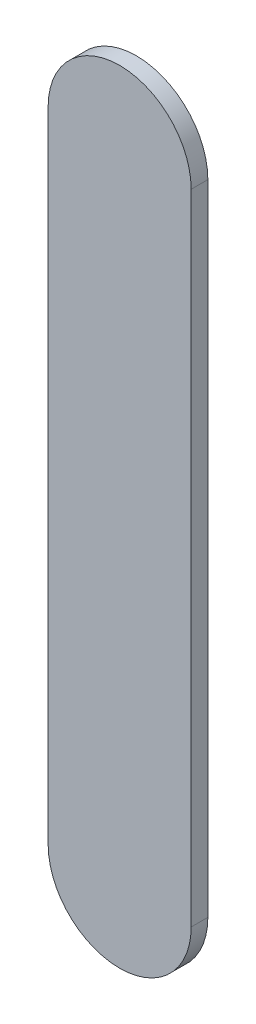
ISO-10303-21;
HEADER;
FILE_DESCRIPTION(('STEP AP214'),'2;1');
FILE_NAME('part.step','',(''),(''),'','','');
FILE_SCHEMA(('AUTOMOTIVE_DESIGN { 1 0 10303 214 1 1 1 1 }'));
ENDSEC;
DATA;
#1=APPLICATION_CONTEXT('core data for automotive mechanical design processes');
#2=APPLICATION_PROTOCOL_DEFINITION('international standard','automotive_design',2000,#1);
#3=PRODUCT_CONTEXT('',#1,'mechanical');
#4=PRODUCT('Part','Part','',(#3));
#5=PRODUCT_RELATED_PRODUCT_CATEGORY('part','',(#4));
#6=PRODUCT_DEFINITION_FORMATION('','',#4);
#7=PRODUCT_DEFINITION_CONTEXT('part definition',#1,'design');
#8=PRODUCT_DEFINITION('design','',#6,#7);
#9=PRODUCT_DEFINITION_SHAPE('','',#8);
#10=(LENGTH_UNIT() NAMED_UNIT(*) SI_UNIT(.MILLI.,.METRE.));
#11=(NAMED_UNIT(*) PLANE_ANGLE_UNIT() SI_UNIT($,.RADIAN.));
#12=(NAMED_UNIT(*) SI_UNIT($,.STERADIAN.) SOLID_ANGLE_UNIT());
#13=UNCERTAINTY_MEASURE_WITH_UNIT(LENGTH_MEASURE(1.E-05),#10,'distance_accuracy_value','');
#14=(GEOMETRIC_REPRESENTATION_CONTEXT(3) GLOBAL_UNCERTAINTY_ASSIGNED_CONTEXT((#13)) GLOBAL_UNIT_ASSIGNED_CONTEXT((#10,
#11,#12)) REPRESENTATION_CONTEXT('',''));
#15=CARTESIAN_POINT('',(0.,0.,0.));
#16=DIRECTION('',(0.,0.,1.));
#17=DIRECTION('',(1.,0.,0.));
#18=AXIS2_PLACEMENT_3D('',#15,#16,#17);
#19=CARTESIAN_POINT('',(127.85,-68.96,0.));
#20=DIRECTION('',(0.,0.,1.));
#21=DIRECTION('',(1.,0.,0.));
#22=AXIS2_PLACEMENT_3D('',#19,#20,#21);
#23=PLANE('',#22);
#24=DIRECTION('',(0.,-1.,0.));
#25=VECTOR('',#24,1.);
#26=CARTESIAN_POINT('',(127.85,-68.96,0.));
#27=LINE('',#26,#25);
#28=CARTESIAN_POINT('',(127.85,-68.96,0.));
#29=VERTEX_POINT('',#28);
#30=CARTESIAN_POINT('',(127.85,-70.3,0.));
#31=VERTEX_POINT('',#30);
#32=EDGE_CURVE('E86',#29,#31,#27,.T.);
#33=ORIENTED_EDGE('',*,*,#32,.T.);
#34=CARTESIAN_POINT('',(128.,-70.3,0.));
#35=DIRECTION('',(0.,0.,1.));
#36=DIRECTION('',(-1.,0.,0.));
#37=AXIS2_PLACEMENT_3D('',#34,#35,#36);
#38=CIRCLE('',#37,0.15);
#39=CARTESIAN_POINT('',(128.15,-70.3,0.));
#40=VERTEX_POINT('',#39);
#41=EDGE_CURVE('E110',#31,#40,#38,.T.);
#42=ORIENTED_EDGE('',*,*,#41,.T.);
#43=DIRECTION('',(0.,1.,0.));
#44=VECTOR('',#43,1.);
#45=CARTESIAN_POINT('',(128.15,-70.3,0.));
#46=LINE('',#45,#44);
#47=CARTESIAN_POINT('',(128.15,-68.96,0.));
#48=VERTEX_POINT('',#47);
#49=EDGE_CURVE('E20',#40,#48,#46,.T.);
#50=ORIENTED_EDGE('',*,*,#49,.T.);
#51=CARTESIAN_POINT('',(128.,-68.96,0.));
#52=DIRECTION('',(0.,0.,1.));
#53=DIRECTION('',(1.,0.,0.));
#54=AXIS2_PLACEMENT_3D('',#51,#52,#53);
#55=CIRCLE('',#54,0.15);
#56=EDGE_CURVE('E11',#48,#29,#55,.T.);
#57=ORIENTED_EDGE('',*,*,#56,.T.);
#58=EDGE_LOOP('',(#33,#42,#50,#57));
#59=FACE_BOUND('',#58,.T.);
#60=ADVANCED_FACE('F17',(#59),#23,.T.);
#61=CARTESIAN_POINT('',(127.85,-68.96,-0.035));
#62=DIRECTION('',(0.,0.,1.));
#63=DIRECTION('',(1.,0.,0.));
#64=AXIS2_PLACEMENT_3D('',#61,#62,#63);
#65=PLANE('',#64);
#66=CARTESIAN_POINT('',(128.,-68.96,-0.035));
#67=DIRECTION('',(0.,0.,1.));
#68=DIRECTION('',(1.,0.,0.));
#69=AXIS2_PLACEMENT_3D('',#66,#67,#68);
#70=CIRCLE('',#69,0.15);
#71=CARTESIAN_POINT('',(128.15,-68.96,-0.035));
#72=VERTEX_POINT('',#71);
#73=CARTESIAN_POINT('',(127.85,-68.96,-0.035));
#74=VERTEX_POINT('',#73);
#75=EDGE_CURVE('E27',#72,#74,#70,.T.);
#76=ORIENTED_EDGE('',*,*,#75,.F.);
#77=DIRECTION('',(0.,1.,0.));
#78=VECTOR('',#77,1.);
#79=CARTESIAN_POINT('',(128.15,-70.3,-0.035));
#80=LINE('',#79,#78);
#81=CARTESIAN_POINT('',(128.15,-70.3,-0.035));
#82=VERTEX_POINT('',#81);
#83=EDGE_CURVE('E54',#82,#72,#80,.T.);
#84=ORIENTED_EDGE('',*,*,#83,.F.);
#85=CARTESIAN_POINT('',(128.,-70.3,-0.035));
#86=DIRECTION('',(0.,0.,1.));
#87=DIRECTION('',(-1.,0.,0.));
#88=AXIS2_PLACEMENT_3D('',#85,#86,#87);
#89=CIRCLE('',#88,0.15);
#90=CARTESIAN_POINT('',(127.85,-70.3,-0.035));
#91=VERTEX_POINT('',#90);
#92=EDGE_CURVE('E88',#91,#82,#89,.T.);
#93=ORIENTED_EDGE('',*,*,#92,.F.);
#94=DIRECTION('',(0.,-1.,0.));
#95=VECTOR('',#94,1.);
#96=CARTESIAN_POINT('',(127.85,-68.96,-0.035));
#97=LINE('',#96,#95);
#98=EDGE_CURVE('E85',#74,#91,#97,.T.);
#99=ORIENTED_EDGE('',*,*,#98,.F.);
#100=EDGE_LOOP('',(#76,#84,#93,#99));
#101=FACE_BOUND('',#100,.T.);
#102=ADVANCED_FACE('F90',(#101),#65,.F.);
#103=CARTESIAN_POINT('',(128.,-68.96,-0.035));
#104=DIRECTION('',(0.,0.,-1.));
#105=DIRECTION('',(1.,0.,0.));
#106=AXIS2_PLACEMENT_3D('',#103,#104,#105);
#107=CYLINDRICAL_SURFACE('',#106,0.15);
#108=ORIENTED_EDGE('',*,*,#75,.T.);
#109=DIRECTION('',(0.,0.,1.));
#110=VECTOR('',#109,1.);
#111=CARTESIAN_POINT('',(127.85,-68.96,-0.035));
#112=LINE('',#111,#110);
#113=EDGE_CURVE('E74',#74,#29,#112,.T.);
#114=ORIENTED_EDGE('',*,*,#113,.T.);
#115=ORIENTED_EDGE('',*,*,#56,.F.);
#116=DIRECTION('',(0.,0.,1.));
#117=VECTOR('',#116,1.);
#118=CARTESIAN_POINT('',(128.15,-68.96,-0.035));
#119=LINE('',#118,#117);
#120=EDGE_CURVE('E77',#72,#48,#119,.T.);
#121=ORIENTED_EDGE('',*,*,#120,.F.);
#122=EDGE_LOOP('',(#108,#114,#115,#121));
#123=FACE_BOUND('',#122,.T.);
#124=ADVANCED_FACE('F73',(#123),#107,.T.);
#125=CARTESIAN_POINT('',(128.15,-70.3,-0.035));
#126=DIRECTION('',(-1.,0.,0.));
#127=DIRECTION('',(0.,0.,1.));
#128=AXIS2_PLACEMENT_3D('',#125,#126,#127);
#129=PLANE('',#128);
#130=ORIENTED_EDGE('',*,*,#83,.T.);
#131=ORIENTED_EDGE('',*,*,#120,.T.);
#132=ORIENTED_EDGE('',*,*,#49,.F.);
#133=DIRECTION('',(0.,0.,1.));
#134=VECTOR('',#133,1.);
#135=CARTESIAN_POINT('',(128.15,-70.3,-0.035));
#136=LINE('',#135,#134);
#137=EDGE_CURVE('E104',#82,#40,#136,.T.);
#138=ORIENTED_EDGE('',*,*,#137,.F.);
#139=EDGE_LOOP('',(#130,#131,#132,#138));
#140=FACE_BOUND('',#139,.T.);
#141=ADVANCED_FACE('F122',(#140),#129,.F.);
#142=CARTESIAN_POINT('',(128.,-70.3,-0.035));
#143=DIRECTION('',(0.,0.,-1.));
#144=DIRECTION('',(-1.,0.,0.));
#145=AXIS2_PLACEMENT_3D('',#142,#143,#144);
#146=CYLINDRICAL_SURFACE('',#145,0.15);
#147=ORIENTED_EDGE('',*,*,#92,.T.);
#148=ORIENTED_EDGE('',*,*,#137,.T.);
#149=ORIENTED_EDGE('',*,*,#41,.F.);
#150=DIRECTION('',(0.,0.,1.));
#151=VECTOR('',#150,1.);
#152=CARTESIAN_POINT('',(127.85,-70.3,-0.035));
#153=LINE('',#152,#151);
#154=EDGE_CURVE('E94',#91,#31,#153,.T.);
#155=ORIENTED_EDGE('',*,*,#154,.F.);
#156=EDGE_LOOP('',(#147,#148,#149,#155));
#157=FACE_BOUND('',#156,.T.);
#158=ADVANCED_FACE('F124',(#157),#146,.T.);
#159=CARTESIAN_POINT('',(127.85,-68.96,-0.035));
#160=DIRECTION('',(1.,0.,0.));
#161=DIRECTION('',(0.,1.,0.));
#162=AXIS2_PLACEMENT_3D('',#159,#160,#161);
#163=PLANE('',#162);
#164=ORIENTED_EDGE('',*,*,#98,.T.);
#165=ORIENTED_EDGE('',*,*,#154,.T.);
#166=ORIENTED_EDGE('',*,*,#32,.F.);
#167=ORIENTED_EDGE('',*,*,#113,.F.);
#168=EDGE_LOOP('',(#164,#165,#166,#167));
#169=FACE_BOUND('',#168,.T.);
#170=ADVANCED_FACE('F83',(#169),#163,.F.);
#171=CLOSED_SHELL('',(#60,#102,#124,#141,#158,#170));
#172=MANIFOLD_SOLID_BREP('B1',#171);
#173=ADVANCED_BREP_SHAPE_REPRESENTATION('',(#18,#172),#14);
#174=SHAPE_DEFINITION_REPRESENTATION(#9,#173);
ENDSEC;
END-ISO-10303-21;
